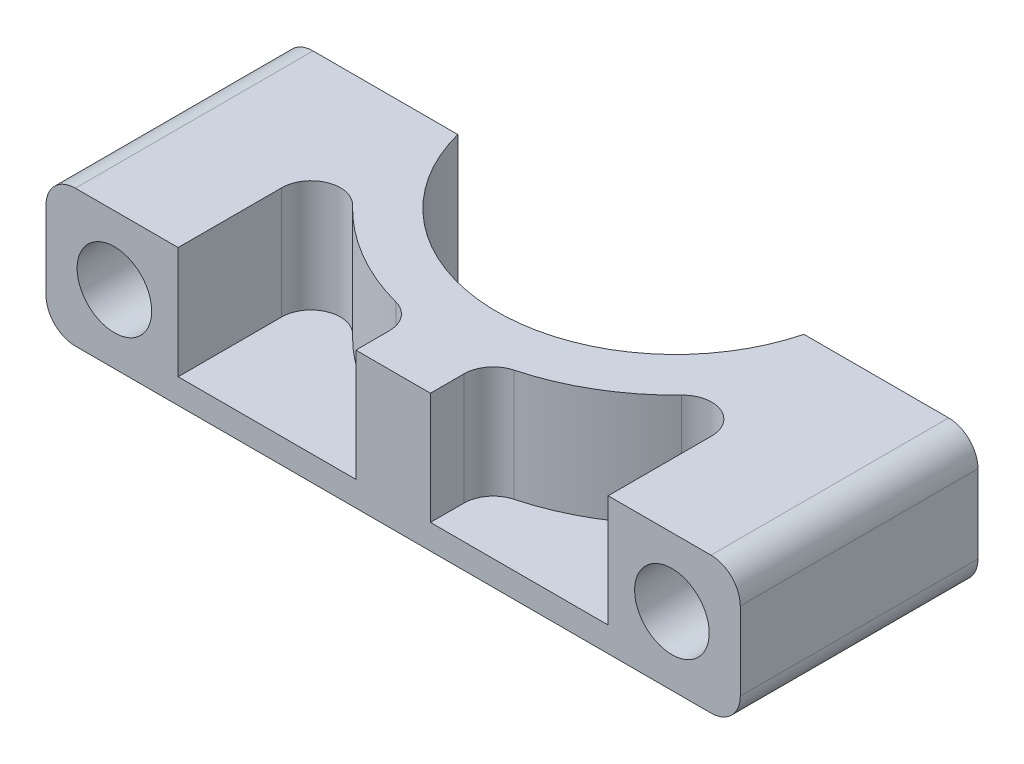
ISO-10303-21;
HEADER;
FILE_DESCRIPTION(('STEP AP214'),'2;1');
FILE_NAME('part.step','',(''),(''),'','','');
FILE_SCHEMA(('AUTOMOTIVE_DESIGN { 1 0 10303 214 1 1 1 1 }'));
ENDSEC;
DATA;
#1=APPLICATION_CONTEXT('core data for automotive mechanical design processes');
#2=APPLICATION_PROTOCOL_DEFINITION('international standard','automotive_design',2000,#1);
#3=PRODUCT_CONTEXT('',#1,'mechanical');
#4=PRODUCT('Part','Part','',(#3));
#5=PRODUCT_RELATED_PRODUCT_CATEGORY('part','',(#4));
#6=PRODUCT_DEFINITION_FORMATION('','',#4);
#7=PRODUCT_DEFINITION_CONTEXT('part definition',#1,'design');
#8=PRODUCT_DEFINITION('design','',#6,#7);
#9=PRODUCT_DEFINITION_SHAPE('','',#8);
#10=(LENGTH_UNIT() NAMED_UNIT(*) SI_UNIT(.MILLI.,.METRE.));
#11=(NAMED_UNIT(*) PLANE_ANGLE_UNIT() SI_UNIT($,.RADIAN.));
#12=(NAMED_UNIT(*) SI_UNIT($,.STERADIAN.) SOLID_ANGLE_UNIT());
#13=UNCERTAINTY_MEASURE_WITH_UNIT(LENGTH_MEASURE(1.E-05),#10,'distance_accuracy_value','');
#14=(GEOMETRIC_REPRESENTATION_CONTEXT(3) GLOBAL_UNCERTAINTY_ASSIGNED_CONTEXT((#13)) GLOBAL_UNIT_ASSIGNED_CONTEXT((#10,
#11,#12)) REPRESENTATION_CONTEXT('',''));
#15=CARTESIAN_POINT('',(0.,0.,0.));
#16=DIRECTION('',(0.,0.,1.));
#17=DIRECTION('',(1.,0.,0.));
#18=AXIS2_PLACEMENT_3D('',#15,#16,#17);
#19=CARTESIAN_POINT('',(-27.9162315761525,11.,22.7193999397355));
#20=DIRECTION('',(0.,0.,-1.));
#21=DIRECTION('',(-1.,0.,0.));
#22=AXIS2_PLACEMENT_3D('',#19,#20,#21);
#23=PLANE('',#22);
#24=DIRECTION('',(1.,0.,0.));
#25=VECTOR('',#24,1.);
#26=CARTESIAN_POINT('',(-27.9162315761525,11.,22.7193999397355));
#27=LINE('',#26,#25);
#28=CARTESIAN_POINT('',(-25.5562315761525,11.,22.7193999397355));
#29=VERTEX_POINT('',#28);
#30=CARTESIAN_POINT('',(-17.2885742756036,11.,22.7193999397355));
#31=VERTEX_POINT('',#30);
#32=EDGE_CURVE('E263',#29,#31,#27,.T.);
#33=ORIENTED_EDGE('',*,*,#32,.F.);
#34=CARTESIAN_POINT('',(-25.5562315761525,8.64,22.7193999397355));
#35=DIRECTION('',(0.,0.,-1.));
#36=DIRECTION('',(-1.,0.,0.));
#37=AXIS2_PLACEMENT_3D('',#34,#35,#36);
#38=CIRCLE('',#37,2.36);
#39=CARTESIAN_POINT('',(-27.9162315761525,8.64,22.7193999397355));
#40=VERTEX_POINT('',#39);
#41=EDGE_CURVE('E346',#29,#40,#38,.F.);
#42=ORIENTED_EDGE('',*,*,#41,.T.);
#43=DIRECTION('',(0.,-1.,0.));
#44=VECTOR('',#43,1.);
#45=CARTESIAN_POINT('',(-27.9162315761525,11.,22.7193999397355));
#46=LINE('',#45,#44);
#47=CARTESIAN_POINT('',(-27.9162315761525,2.36,22.7193999397355));
#48=VERTEX_POINT('',#47);
#49=EDGE_CURVE('E297',#40,#48,#46,.T.);
#50=ORIENTED_EDGE('',*,*,#49,.T.);
#51=CARTESIAN_POINT('',(-25.5562315761525,2.36,22.7193999397355));
#52=DIRECTION('',(0.,0.,-1.));
#53=DIRECTION('',(-1.,0.,0.));
#54=AXIS2_PLACEMENT_3D('',#51,#52,#53);
#55=CIRCLE('',#54,2.36);
#56=CARTESIAN_POINT('',(-25.5562315761525,0.,22.7193999397355));
#57=VERTEX_POINT('',#56);
#58=EDGE_CURVE('E344',#48,#57,#55,.F.);
#59=ORIENTED_EDGE('',*,*,#58,.T.);
#60=DIRECTION('',(1.,0.,0.));
#61=VECTOR('',#60,1.);
#62=CARTESIAN_POINT('',(-27.9162315761525,0.,22.7193999397355));
#63=LINE('',#62,#61);
#64=CARTESIAN_POINT('',(25.5562315761525,0.,22.7193999397355));
#65=VERTEX_POINT('',#64);
#66=EDGE_CURVE('E262',#57,#65,#63,.T.);
#67=ORIENTED_EDGE('',*,*,#66,.T.);
#68=CARTESIAN_POINT('',(25.5562315761525,2.36,22.7193999397355));
#69=DIRECTION('',(0.,0.,-1.));
#70=DIRECTION('',(-1.,0.,0.));
#71=AXIS2_PLACEMENT_3D('',#68,#69,#70);
#72=CIRCLE('',#71,2.36);
#73=CARTESIAN_POINT('',(27.9162315761525,2.36,22.7193999397355));
#74=VERTEX_POINT('',#73);
#75=EDGE_CURVE('E340',#65,#74,#72,.F.);
#76=ORIENTED_EDGE('',*,*,#75,.T.);
#77=DIRECTION('',(0.,-1.,0.));
#78=VECTOR('',#77,1.);
#79=CARTESIAN_POINT('',(27.9162315761525,11.,22.7193999397355));
#80=LINE('',#79,#78);
#81=CARTESIAN_POINT('',(27.9162315761525,8.64,22.7193999397355));
#82=VERTEX_POINT('',#81);
#83=EDGE_CURVE('E294',#82,#74,#80,.T.);
#84=ORIENTED_EDGE('',*,*,#83,.F.);
#85=CARTESIAN_POINT('',(25.5562315761525,8.64,22.7193999397355));
#86=DIRECTION('',(0.,0.,-1.));
#87=DIRECTION('',(-1.,0.,0.));
#88=AXIS2_PLACEMENT_3D('',#85,#86,#87);
#89=CIRCLE('',#88,2.36);
#90=CARTESIAN_POINT('',(25.5562315761525,11.,22.7193999397355));
#91=VERTEX_POINT('',#90);
#92=EDGE_CURVE('E342',#82,#91,#89,.F.);
#93=ORIENTED_EDGE('',*,*,#92,.T.);
#94=CARTESIAN_POINT('',(17.2885742756036,11.,22.7193999397355));
#95=VERTEX_POINT('',#94);
#96=EDGE_CURVE('E267',#95,#91,#27,.T.);
#97=ORIENTED_EDGE('',*,*,#96,.F.);
#98=DIRECTION('',(0.,1.,0.));
#99=VECTOR('',#98,1.);
#100=CARTESIAN_POINT('',(17.2885742756036,2.,22.7193999397355));
#101=LINE('',#100,#99);
#102=CARTESIAN_POINT('',(17.2885742756036,2.,22.7193999397355));
#103=VERTEX_POINT('',#102);
#104=EDGE_CURVE('E220',#103,#95,#101,.T.);
#105=ORIENTED_EDGE('',*,*,#104,.F.);
#106=DIRECTION('',(1.,0.,0.));
#107=VECTOR('',#106,1.);
#108=CARTESIAN_POINT('',(0.,2.,22.7193999397355));
#109=LINE('',#108,#107);
#110=CARTESIAN_POINT('',(3.,2.,22.7193999397355));
#111=VERTEX_POINT('',#110);
#112=EDGE_CURVE('E234',#111,#103,#109,.T.);
#113=ORIENTED_EDGE('',*,*,#112,.F.);
#114=DIRECTION('',(0.,1.,0.));
#115=VECTOR('',#114,1.);
#116=CARTESIAN_POINT('',(3.,2.,22.7193999397355));
#117=LINE('',#116,#115);
#118=CARTESIAN_POINT('',(3.,11.,22.7193999397355));
#119=VERTEX_POINT('',#118);
#120=EDGE_CURVE('E239',#111,#119,#117,.T.);
#121=ORIENTED_EDGE('',*,*,#120,.T.);
#122=CARTESIAN_POINT('',(-3.,11.,22.7193999397355));
#123=VERTEX_POINT('',#122);
#124=EDGE_CURVE('E266',#123,#119,#27,.T.);
#125=ORIENTED_EDGE('',*,*,#124,.F.);
#126=DIRECTION('',(0.,1.,0.));
#127=VECTOR('',#126,1.);
#128=CARTESIAN_POINT('',(-3.,2.,22.7193999397355));
#129=LINE('',#128,#127);
#130=CARTESIAN_POINT('',(-3.,2.,22.7193999397355));
#131=VERTEX_POINT('',#130);
#132=EDGE_CURVE('E207',#131,#123,#129,.T.);
#133=ORIENTED_EDGE('',*,*,#132,.F.);
#134=DIRECTION('',(1.,0.,0.));
#135=VECTOR('',#134,1.);
#136=CARTESIAN_POINT('',(0.,2.,22.7193999397355));
#137=LINE('',#136,#135);
#138=CARTESIAN_POINT('',(-17.2885742756036,2.,22.7193999397355));
#139=VERTEX_POINT('',#138);
#140=EDGE_CURVE('E190',#139,#131,#137,.T.);
#141=ORIENTED_EDGE('',*,*,#140,.F.);
#142=DIRECTION('',(0.,1.,0.));
#143=VECTOR('',#142,1.);
#144=CARTESIAN_POINT('',(-17.2885742756036,2.,22.7193999397355));
#145=LINE('',#144,#143);
#146=EDGE_CURVE('E201',#139,#31,#145,.T.);
#147=ORIENTED_EDGE('',*,*,#146,.T.);
#148=EDGE_LOOP('',(#33,#42,#50,#59,#67,#76,#84,#93,#97,#105,#113,#121,#125,#133,#141,#147));
#149=FACE_BOUND('',#148,.T.);
#150=CARTESIAN_POINT('',(22.4162315761525,5.5,22.7193999397355));
#151=DIRECTION('',(0.,0.,-1.));
#152=DIRECTION('',(-1.,0.,0.));
#153=AXIS2_PLACEMENT_3D('',#150,#151,#152);
#154=CIRCLE('',#153,3.);
#155=CARTESIAN_POINT('',(19.4162315761525,5.5,22.7193999397355));
#156=VERTEX_POINT('',#155);
#157=EDGE_CURVE('E259',#156,#156,#154,.T.);
#158=ORIENTED_EDGE('',*,*,#157,.T.);
#159=EDGE_LOOP('',(#158));
#160=FACE_BOUND('',#159,.T.);
#161=CARTESIAN_POINT('',(-22.4162315761525,5.5,22.7193999397355));
#162=DIRECTION('',(0.,0.,-1.));
#163=DIRECTION('',(-1.,0.,0.));
#164=AXIS2_PLACEMENT_3D('',#161,#162,#163);
#165=CIRCLE('',#164,3.);
#166=CARTESIAN_POINT('',(-25.4162315761525,5.5,22.7193999397355));
#167=VERTEX_POINT('',#166);
#168=EDGE_CURVE('E254',#167,#167,#165,.T.);
#169=ORIENTED_EDGE('',*,*,#168,.T.);
#170=EDGE_LOOP('',(#169));
#171=FACE_BOUND('',#170,.T.);
#172=ADVANCED_FACE('F35',(#149,#160,#171),#23,.F.);
#173=CARTESIAN_POINT('',(0.,11.,0.));
#174=DIRECTION('',(0.,1.,0.));
#175=DIRECTION('',(0.,0.,1.));
#176=AXIS2_PLACEMENT_3D('',#173,#174,#175);
#177=PLANE('',#176);
#178=DIRECTION('',(-1.,0.,0.));
#179=VECTOR('',#178,1.);
#180=CARTESIAN_POINT('',(-27.9162315761525,11.,3.60265509296923));
#181=LINE('',#180,#179);
#182=CARTESIAN_POINT('',(-13.9162315761525,11.,3.60265509296922));
#183=VERTEX_POINT('',#182);
#184=CARTESIAN_POINT('',(-25.5562315761525,11.,3.60265509296923));
#185=VERTEX_POINT('',#184);
#186=EDGE_CURVE('E271',#183,#185,#181,.T.);
#187=ORIENTED_EDGE('',*,*,#186,.T.);
#188=DIRECTION('',(0.,0.,1.));
#189=VECTOR('',#188,1.);
#190=CARTESIAN_POINT('',(-25.5562315761525,11.,22.7193999397355));
#191=LINE('',#190,#189);
#192=EDGE_CURVE('E337',#185,#29,#191,.T.);
#193=ORIENTED_EDGE('',*,*,#192,.T.);
#194=ORIENTED_EDGE('',*,*,#32,.T.);
#195=DIRECTION('',(0.,0.,1.));
#196=VECTOR('',#195,1.);
#197=CARTESIAN_POINT('',(-17.2885742756036,11.,0.));
#198=LINE('',#197,#196);
#199=CARTESIAN_POINT('',(-17.2885742756036,11.,14.3902013570967));
#200=VERTEX_POINT('',#199);
#201=EDGE_CURVE('E204',#200,#31,#198,.T.);
#202=ORIENTED_EDGE('',*,*,#201,.F.);
#203=CARTESIAN_POINT('',(-14.9285742756036,11.,14.3902013570967));
#204=DIRECTION('',(0.,1.,0.));
#205=DIRECTION('',(0.,0.,1.));
#206=AXIS2_PLACEMENT_3D('',#203,#204,#205);
#207=CIRCLE('',#206,2.36);
#208=CARTESIAN_POINT('',(-13.2294454938132,11.,12.7523486827418));
#209=VERTEX_POINT('',#208);
#210=EDGE_CURVE('E326',#200,#209,#207,.F.);
#211=ORIENTED_EDGE('',*,*,#210,.T.);
#212=CARTESIAN_POINT('',(0.,11.,0.));
#213=DIRECTION('',(0.,1.,0.));
#214=DIRECTION('',(0.,0.,1.));
#215=AXIS2_PLACEMENT_3D('',#212,#213,#214);
#216=CIRCLE('',#215,18.375);
#217=CARTESIAN_POINT('',(-4.74993971545696,11.,17.7504562673618));
#218=VERTEX_POINT('',#217);
#219=EDGE_CURVE('E217',#209,#218,#216,.T.);
#220=ORIENTED_EDGE('',*,*,#219,.T.);
#221=CARTESIAN_POINT('',(-5.36,11.,20.0302427593876));
#222=DIRECTION('',(0.,1.,0.));
#223=DIRECTION('',(0.,0.,1.));
#224=AXIS2_PLACEMENT_3D('',#221,#222,#223);
#225=CIRCLE('',#224,2.36);
#226=CARTESIAN_POINT('',(-3.,11.,20.0302427593876));
#227=VERTEX_POINT('',#226);
#228=EDGE_CURVE('E330',#218,#227,#225,.F.);
#229=ORIENTED_EDGE('',*,*,#228,.T.);
#230=DIRECTION('',(0.,0.,-1.));
#231=VECTOR('',#230,1.);
#232=CARTESIAN_POINT('',(-3.,11.,0.));
#233=LINE('',#232,#231);
#234=EDGE_CURVE('E222',#123,#227,#233,.T.);
#235=ORIENTED_EDGE('',*,*,#234,.F.);
#236=ORIENTED_EDGE('',*,*,#124,.T.);
#237=DIRECTION('',(0.,0.,-1.));
#238=VECTOR('',#237,1.);
#239=CARTESIAN_POINT('',(3.,11.,0.));
#240=LINE('',#239,#238);
#241=CARTESIAN_POINT('',(3.,11.,20.0302427593876));
#242=VERTEX_POINT('',#241);
#243=EDGE_CURVE('E243',#119,#242,#240,.T.);
#244=ORIENTED_EDGE('',*,*,#243,.T.);
#245=CARTESIAN_POINT('',(5.36,11.,20.0302427593876));
#246=DIRECTION('',(0.,1.,0.));
#247=DIRECTION('',(0.,0.,1.));
#248=AXIS2_PLACEMENT_3D('',#245,#246,#247);
#249=CIRCLE('',#248,2.36);
#250=CARTESIAN_POINT('',(4.74993971545696,11.,17.7504562673618));
#251=VERTEX_POINT('',#250);
#252=EDGE_CURVE('E332',#242,#251,#249,.F.);
#253=ORIENTED_EDGE('',*,*,#252,.T.);
#254=CARTESIAN_POINT('',(0.,11.,0.));
#255=DIRECTION('',(0.,1.,0.));
#256=DIRECTION('',(0.,0.,1.));
#257=AXIS2_PLACEMENT_3D('',#254,#255,#256);
#258=CIRCLE('',#257,18.375);
#259=CARTESIAN_POINT('',(13.2294454938132,11.,12.7523486827418));
#260=VERTEX_POINT('',#259);
#261=EDGE_CURVE('E240',#251,#260,#258,.T.);
#262=ORIENTED_EDGE('',*,*,#261,.T.);
#263=CARTESIAN_POINT('',(14.9285742756036,11.,14.3902013570967));
#264=DIRECTION('',(0.,1.,0.));
#265=DIRECTION('',(0.,0.,1.));
#266=AXIS2_PLACEMENT_3D('',#263,#264,#265);
#267=CIRCLE('',#266,2.36);
#268=CARTESIAN_POINT('',(17.2885742756036,11.,14.3902013570967));
#269=VERTEX_POINT('',#268);
#270=EDGE_CURVE('E328',#260,#269,#267,.F.);
#271=ORIENTED_EDGE('',*,*,#270,.T.);
#272=DIRECTION('',(0.,0.,1.));
#273=VECTOR('',#272,1.);
#274=CARTESIAN_POINT('',(17.2885742756036,11.,0.));
#275=LINE('',#274,#273);
#276=EDGE_CURVE('E231',#269,#95,#275,.T.);
#277=ORIENTED_EDGE('',*,*,#276,.T.);
#278=ORIENTED_EDGE('',*,*,#96,.T.);
#279=DIRECTION('',(0.,0.,-1.));
#280=VECTOR('',#279,1.);
#281=CARTESIAN_POINT('',(25.5562315761525,11.,3.60265509296923));
#282=LINE('',#281,#280);
#283=CARTESIAN_POINT('',(25.5562315761525,11.,3.60265509296923));
#284=VERTEX_POINT('',#283);
#285=EDGE_CURVE('E334',#91,#284,#282,.T.);
#286=ORIENTED_EDGE('',*,*,#285,.T.);
#287=DIRECTION('',(-1.,0.,0.));
#288=VECTOR('',#287,1.);
#289=CARTESIAN_POINT('',(13.9162315761525,11.,3.60265509296923));
#290=LINE('',#289,#288);
#291=CARTESIAN_POINT('',(13.9162315761525,11.,3.60265509296923));
#292=VERTEX_POINT('',#291);
#293=EDGE_CURVE('E265',#284,#292,#290,.T.);
#294=ORIENTED_EDGE('',*,*,#293,.T.);
#295=CARTESIAN_POINT('',(0.,11.,0.));
#296=DIRECTION('',(0.,-1.,0.));
#297=DIRECTION('',(0.,0.,1.));
#298=AXIS2_PLACEMENT_3D('',#295,#296,#297);
#299=CIRCLE('',#298,14.375);
#300=EDGE_CURVE('E269',#292,#183,#299,.T.);
#301=ORIENTED_EDGE('',*,*,#300,.T.);
#302=EDGE_LOOP('',(#187,#193,#194,#202,#211,#220,#229,#235,#236,#244,#253,#262,#271,#277,#278,
#286,#294,#301));
#303=FACE_BOUND('',#302,.T.);
#304=ADVANCED_FACE('F394',(#303),#177,.T.);
#305=CARTESIAN_POINT('',(-27.9162315761525,11.,22.7193999397355));
#306=DIRECTION('',(1.,0.,0.));
#307=DIRECTION('',(0.,0.,-1.));
#308=AXIS2_PLACEMENT_3D('',#305,#306,#307);
#309=PLANE('',#308);
#310=ORIENTED_EDGE('',*,*,#49,.F.);
#311=DIRECTION('',(0.,0.,1.));
#312=VECTOR('',#311,1.);
#313=CARTESIAN_POINT('',(-27.9162315761525,8.64,3.60265509296923));
#314=LINE('',#313,#312);
#315=CARTESIAN_POINT('',(-27.9162315761525,8.64,3.60265509296923));
#316=VERTEX_POINT('',#315);
#317=EDGE_CURVE('E351',#40,#316,#314,.F.);
#318=ORIENTED_EDGE('',*,*,#317,.T.);
#319=DIRECTION('',(0.,-1.,0.));
#320=VECTOR('',#319,1.);
#321=CARTESIAN_POINT('',(-27.9162315761525,11.,3.60265509296923));
#322=LINE('',#321,#320);
#323=CARTESIAN_POINT('',(-27.9162315761525,2.36,3.60265509296923));
#324=VERTEX_POINT('',#323);
#325=EDGE_CURVE('E274',#316,#324,#322,.T.);
#326=ORIENTED_EDGE('',*,*,#325,.T.);
#327=DIRECTION('',(0.,0.,1.));
#328=VECTOR('',#327,1.);
#329=CARTESIAN_POINT('',(-27.9162315761525,2.36,22.7193999397355));
#330=LINE('',#329,#328);
#331=EDGE_CURVE('E348',#324,#48,#330,.T.);
#332=ORIENTED_EDGE('',*,*,#331,.T.);
#333=EDGE_LOOP('',(#310,#318,#326,#332));
#334=FACE_BOUND('',#333,.T.);
#335=ADVANCED_FACE('F387',(#334),#309,.F.);
#336=CARTESIAN_POINT('',(27.9162315761525,11.,22.7193999397355));
#337=DIRECTION('',(-1.,0.,0.));
#338=DIRECTION('',(0.,0.,1.));
#339=AXIS2_PLACEMENT_3D('',#336,#337,#338);
#340=PLANE('',#339);
#341=DIRECTION('',(0.,-1.,0.));
#342=VECTOR('',#341,1.);
#343=CARTESIAN_POINT('',(27.9162315761525,11.,3.60265509296923));
#344=LINE('',#343,#342);
#345=CARTESIAN_POINT('',(27.9162315761525,8.64,3.60265509296923));
#346=VERTEX_POINT('',#345);
#347=CARTESIAN_POINT('',(27.9162315761525,2.36,3.60265509296923));
#348=VERTEX_POINT('',#347);
#349=EDGE_CURVE('E292',#346,#348,#344,.T.);
#350=ORIENTED_EDGE('',*,*,#349,.F.);
#351=DIRECTION('',(0.,0.,-1.));
#352=VECTOR('',#351,1.);
#353=CARTESIAN_POINT('',(27.9162315761525,8.64,22.7193999397355));
#354=LINE('',#353,#352);
#355=EDGE_CURVE('E11',#346,#82,#354,.F.);
#356=ORIENTED_EDGE('',*,*,#355,.T.);
#357=ORIENTED_EDGE('',*,*,#83,.T.);
#358=DIRECTION('',(0.,0.,-1.));
#359=VECTOR('',#358,1.);
#360=CARTESIAN_POINT('',(27.9162315761525,2.36,22.7193999397355));
#361=LINE('',#360,#359);
#362=EDGE_CURVE('E43',#74,#348,#361,.T.);
#363=ORIENTED_EDGE('',*,*,#362,.T.);
#364=EDGE_LOOP('',(#350,#356,#357,#363));
#365=FACE_BOUND('',#364,.T.);
#366=ADVANCED_FACE('F363',(#365),#340,.F.);
#367=CARTESIAN_POINT('',(13.9162315761525,11.,3.60265509296923));
#368=DIRECTION('',(0.,0.,1.));
#369=DIRECTION('',(1.,0.,0.));
#370=AXIS2_PLACEMENT_3D('',#367,#368,#369);
#371=PLANE('',#370);
#372=CARTESIAN_POINT('',(22.4162315761525,5.5,3.60265509296923));
#373=DIRECTION('',(0.,0.,-1.));
#374=DIRECTION('',(-1.,0.,0.));
#375=AXIS2_PLACEMENT_3D('',#372,#373,#374);
#376=CIRCLE('',#375,3.);
#377=CARTESIAN_POINT('',(19.4162315761525,5.5,3.60265509296923));
#378=VERTEX_POINT('',#377);
#379=EDGE_CURVE('E225',#378,#378,#376,.T.);
#380=ORIENTED_EDGE('',*,*,#379,.F.);
#381=EDGE_LOOP('',(#380));
#382=FACE_BOUND('',#381,.T.);
#383=ORIENTED_EDGE('',*,*,#293,.F.);
#384=CARTESIAN_POINT('',(25.5562315761525,8.64,3.60265509296923));
#385=DIRECTION('',(0.,0.,1.));
#386=DIRECTION('',(1.,0.,0.));
#387=AXIS2_PLACEMENT_3D('',#384,#385,#386);
#388=CIRCLE('',#387,2.36);
#389=EDGE_CURVE('E58',#284,#346,#388,.F.);
#390=ORIENTED_EDGE('',*,*,#389,.T.);
#391=ORIENTED_EDGE('',*,*,#349,.T.);
#392=CARTESIAN_POINT('',(25.5562315761525,2.36,3.60265509296923));
#393=DIRECTION('',(0.,0.,1.));
#394=DIRECTION('',(1.,0.,0.));
#395=AXIS2_PLACEMENT_3D('',#392,#393,#394);
#396=CIRCLE('',#395,2.36);
#397=CARTESIAN_POINT('',(25.5562315761525,0.,3.60265509296923));
#398=VERTEX_POINT('',#397);
#399=EDGE_CURVE('E50',#348,#398,#396,.F.);
#400=ORIENTED_EDGE('',*,*,#399,.T.);
#401=DIRECTION('',(-1.,0.,0.));
#402=VECTOR('',#401,1.);
#403=CARTESIAN_POINT('',(13.9162315761525,0.,3.60265509296923));
#404=LINE('',#403,#402);
#405=CARTESIAN_POINT('',(13.9162315761525,0.,3.60265509296923));
#406=VERTEX_POINT('',#405);
#407=EDGE_CURVE('E277',#398,#406,#404,.T.);
#408=ORIENTED_EDGE('',*,*,#407,.T.);
#409=DIRECTION('',(0.,-1.,0.));
#410=VECTOR('',#409,1.);
#411=CARTESIAN_POINT('',(13.9162315761525,11.,3.60265509296923));
#412=LINE('',#411,#410);
#413=EDGE_CURVE('E289',#292,#406,#412,.T.);
#414=ORIENTED_EDGE('',*,*,#413,.F.);
#415=EDGE_LOOP('',(#383,#390,#391,#400,#408,#414));
#416=FACE_BOUND('',#415,.T.);
#417=ADVANCED_FACE('F367',(#382,#416),#371,.F.);
#418=CARTESIAN_POINT('',(0.,11.,0.));
#419=DIRECTION('',(0.,-1.,0.));
#420=DIRECTION('',(0.,0.,-1.));
#421=AXIS2_PLACEMENT_3D('',#418,#419,#420);
#422=CYLINDRICAL_SURFACE('',#421,14.375);
#423=CARTESIAN_POINT('',(0.,0.,0.));
#424=DIRECTION('',(0.,-1.,0.));
#425=DIRECTION('',(0.,0.,1.));
#426=AXIS2_PLACEMENT_3D('',#423,#424,#425);
#427=CIRCLE('',#426,14.375);
#428=CARTESIAN_POINT('',(-13.9162315761525,0.,3.60265509296922));
#429=VERTEX_POINT('',#428);
#430=EDGE_CURVE('E279',#406,#429,#427,.T.);
#431=ORIENTED_EDGE('',*,*,#430,.T.);
#432=DIRECTION('',(0.,-1.,0.));
#433=VECTOR('',#432,1.);
#434=CARTESIAN_POINT('',(-13.9162315761525,11.,3.60265509296922));
#435=LINE('',#434,#433);
#436=EDGE_CURVE('E286',#183,#429,#435,.T.);
#437=ORIENTED_EDGE('',*,*,#436,.F.);
#438=ORIENTED_EDGE('',*,*,#300,.F.);
#439=ORIENTED_EDGE('',*,*,#413,.T.);
#440=EDGE_LOOP('',(#431,#437,#438,#439));
#441=FACE_BOUND('',#440,.T.);
#442=ADVANCED_FACE('F398',(#441),#422,.F.);
#443=CARTESIAN_POINT('',(-27.9162315761525,11.,3.60265509296923));
#444=DIRECTION('',(0.,0.,1.));
#445=DIRECTION('',(1.,0.,0.));
#446=AXIS2_PLACEMENT_3D('',#443,#444,#445);
#447=PLANE('',#446);
#448=CARTESIAN_POINT('',(-22.4162315761525,5.5,3.60265509296923));
#449=DIRECTION('',(0.,0.,-1.));
#450=DIRECTION('',(-1.,0.,0.));
#451=AXIS2_PLACEMENT_3D('',#448,#449,#450);
#452=CIRCLE('',#451,3.);
#453=CARTESIAN_POINT('',(-25.4162315761525,5.5,3.60265509296923));
#454=VERTEX_POINT('',#453);
#455=EDGE_CURVE('E251',#454,#454,#452,.T.);
#456=ORIENTED_EDGE('',*,*,#455,.F.);
#457=EDGE_LOOP('',(#456));
#458=FACE_BOUND('',#457,.T.);
#459=ORIENTED_EDGE('',*,*,#325,.F.);
#460=CARTESIAN_POINT('',(-25.5562315761525,8.64,3.60265509296923));
#461=DIRECTION('',(0.,0.,1.));
#462=DIRECTION('',(1.,0.,0.));
#463=AXIS2_PLACEMENT_3D('',#460,#461,#462);
#464=CIRCLE('',#463,2.36);
#465=EDGE_CURVE('E355',#316,#185,#464,.F.);
#466=ORIENTED_EDGE('',*,*,#465,.T.);
#467=ORIENTED_EDGE('',*,*,#186,.F.);
#468=ORIENTED_EDGE('',*,*,#436,.T.);
#469=DIRECTION('',(-1.,0.,0.));
#470=VECTOR('',#469,1.);
#471=CARTESIAN_POINT('',(-27.9162315761525,0.,3.60265509296923));
#472=LINE('',#471,#470);
#473=CARTESIAN_POINT('',(-25.5562315761525,0.,3.60265509296923));
#474=VERTEX_POINT('',#473);
#475=EDGE_CURVE('E281',#429,#474,#472,.T.);
#476=ORIENTED_EDGE('',*,*,#475,.T.);
#477=CARTESIAN_POINT('',(-25.5562315761525,2.36,3.60265509296923));
#478=DIRECTION('',(0.,0.,1.));
#479=DIRECTION('',(1.,0.,0.));
#480=AXIS2_PLACEMENT_3D('',#477,#478,#479);
#481=CIRCLE('',#480,2.36);
#482=EDGE_CURVE('E353',#474,#324,#481,.F.);
#483=ORIENTED_EDGE('',*,*,#482,.T.);
#484=EDGE_LOOP('',(#459,#466,#467,#468,#476,#483));
#485=FACE_BOUND('',#484,.T.);
#486=ADVANCED_FACE('F383',(#458,#485),#447,.F.);
#487=CARTESIAN_POINT('',(0.,0.,0.));
#488=DIRECTION('',(0.,1.,0.));
#489=DIRECTION('',(0.,0.,1.));
#490=AXIS2_PLACEMENT_3D('',#487,#488,#489);
#491=PLANE('',#490);
#492=ORIENTED_EDGE('',*,*,#66,.F.);
#493=DIRECTION('',(0.,0.,1.));
#494=VECTOR('',#493,1.);
#495=CARTESIAN_POINT('',(-25.5562315761525,0.,0.));
#496=LINE('',#495,#494);
#497=EDGE_CURVE('E359',#57,#474,#496,.F.);
#498=ORIENTED_EDGE('',*,*,#497,.T.);
#499=ORIENTED_EDGE('',*,*,#475,.F.);
#500=ORIENTED_EDGE('',*,*,#430,.F.);
#501=ORIENTED_EDGE('',*,*,#407,.F.);
#502=DIRECTION('',(0.,0.,-1.));
#503=VECTOR('',#502,1.);
#504=CARTESIAN_POINT('',(25.5562315761525,0.,0.));
#505=LINE('',#504,#503);
#506=EDGE_CURVE('E357',#398,#65,#505,.F.);
#507=ORIENTED_EDGE('',*,*,#506,.T.);
#508=EDGE_LOOP('',(#492,#498,#499,#500,#501,#507));
#509=FACE_BOUND('',#508,.T.);
#510=ADVANCED_FACE('F373',(#509),#491,.F.);
#511=CARTESIAN_POINT('',(-22.4162315761525,5.5,33.6026550929692));
#512=DIRECTION('',(0.,0.,-1.));
#513=DIRECTION('',(-1.,0.,0.));
#514=AXIS2_PLACEMENT_3D('',#511,#512,#513);
#515=CYLINDRICAL_SURFACE('',#514,3.);
#516=ORIENTED_EDGE('',*,*,#455,.T.);
#517=EDGE_LOOP('',(#516));
#518=FACE_BOUND('',#517,.T.);
#519=ORIENTED_EDGE('',*,*,#168,.F.);
#520=EDGE_LOOP('',(#519));
#521=FACE_BOUND('',#520,.T.);
#522=ADVANCED_FACE('F482',(#518,#521),#515,.F.);
#523=CARTESIAN_POINT('',(22.4162315761525,5.5,33.6026550929692));
#524=DIRECTION('',(0.,0.,-1.));
#525=DIRECTION('',(-1.,0.,0.));
#526=AXIS2_PLACEMENT_3D('',#523,#524,#525);
#527=CYLINDRICAL_SURFACE('',#526,3.);
#528=ORIENTED_EDGE('',*,*,#379,.T.);
#529=EDGE_LOOP('',(#528));
#530=FACE_BOUND('',#529,.T.);
#531=ORIENTED_EDGE('',*,*,#157,.F.);
#532=EDGE_LOOP('',(#531));
#533=FACE_BOUND('',#532,.T.);
#534=ADVANCED_FACE('F477',(#530,#533),#527,.F.);
#535=CARTESIAN_POINT('',(0.,2.,0.));
#536=DIRECTION('',(0.,1.,0.));
#537=DIRECTION('',(0.,0.,1.));
#538=AXIS2_PLACEMENT_3D('',#535,#536,#537);
#539=CYLINDRICAL_SURFACE('',#538,18.375);
#540=CARTESIAN_POINT('',(0.,2.,0.));
#541=DIRECTION('',(0.,1.,0.));
#542=DIRECTION('',(0.,0.,1.));
#543=AXIS2_PLACEMENT_3D('',#540,#541,#542);
#544=CIRCLE('',#543,18.375);
#545=CARTESIAN_POINT('',(4.74993971545696,2.,17.7504562673618));
#546=VERTEX_POINT('',#545);
#547=CARTESIAN_POINT('',(13.2294454938132,2.,12.7523486827418));
#548=VERTEX_POINT('',#547);
#549=EDGE_CURVE('E227',#546,#548,#544,.T.);
#550=ORIENTED_EDGE('',*,*,#549,.T.);
#551=DIRECTION('',(0.,1.,0.));
#552=VECTOR('',#551,1.);
#553=CARTESIAN_POINT('',(13.2294454938132,2.,12.7523486827418));
#554=LINE('',#553,#552);
#555=EDGE_CURVE('E312',#548,#260,#554,.T.);
#556=ORIENTED_EDGE('',*,*,#555,.T.);
#557=ORIENTED_EDGE('',*,*,#261,.F.);
#558=DIRECTION('',(0.,1.,0.));
#559=VECTOR('',#558,1.);
#560=CARTESIAN_POINT('',(4.74993971545696,2.,17.7504562673618));
#561=LINE('',#560,#559);
#562=EDGE_CURVE('E310',#251,#546,#561,.F.);
#563=ORIENTED_EDGE('',*,*,#562,.T.);
#564=EDGE_LOOP('',(#550,#556,#557,#563));
#565=FACE_BOUND('',#564,.T.);
#566=ADVANCED_FACE('F464',(#565),#539,.T.);
#567=CARTESIAN_POINT('',(17.2885742756036,2.,0.));
#568=DIRECTION('',(-1.,0.,0.));
#569=DIRECTION('',(0.,0.,1.));
#570=AXIS2_PLACEMENT_3D('',#567,#568,#569);
#571=PLANE('',#570);
#572=ORIENTED_EDGE('',*,*,#276,.F.);
#573=DIRECTION('',(0.,-1.,0.));
#574=VECTOR('',#573,1.);
#575=CARTESIAN_POINT('',(17.2885742756036,2.,14.3902013570967));
#576=LINE('',#575,#574);
#577=CARTESIAN_POINT('',(17.2885742756036,2.,14.3902013570967));
#578=VERTEX_POINT('',#577);
#579=EDGE_CURVE('E315',#269,#578,#576,.T.);
#580=ORIENTED_EDGE('',*,*,#579,.T.);
#581=DIRECTION('',(0.,0.,1.));
#582=VECTOR('',#581,1.);
#583=CARTESIAN_POINT('',(17.2885742756036,2.,0.));
#584=LINE('',#583,#582);
#585=EDGE_CURVE('E237',#578,#103,#584,.T.);
#586=ORIENTED_EDGE('',*,*,#585,.T.);
#587=ORIENTED_EDGE('',*,*,#104,.T.);
#588=EDGE_LOOP('',(#572,#580,#586,#587));
#589=FACE_BOUND('',#588,.T.);
#590=ADVANCED_FACE('F469',(#589),#571,.T.);
#591=CARTESIAN_POINT('',(3.,2.,0.));
#592=DIRECTION('',(1.,0.,0.));
#593=DIRECTION('',(0.,0.,-1.));
#594=AXIS2_PLACEMENT_3D('',#591,#592,#593);
#595=PLANE('',#594);
#596=DIRECTION('',(0.,0.,-1.));
#597=VECTOR('',#596,1.);
#598=CARTESIAN_POINT('',(3.,2.,0.));
#599=LINE('',#598,#597);
#600=CARTESIAN_POINT('',(3.,2.,20.0302427593876));
#601=VERTEX_POINT('',#600);
#602=EDGE_CURVE('E230',#111,#601,#599,.T.);
#603=ORIENTED_EDGE('',*,*,#602,.T.);
#604=DIRECTION('',(0.,-1.,0.));
#605=VECTOR('',#604,1.);
#606=CARTESIAN_POINT('',(3.,11.,20.0302427593876));
#607=LINE('',#606,#605);
#608=EDGE_CURVE('E323',#601,#242,#607,.F.);
#609=ORIENTED_EDGE('',*,*,#608,.T.);
#610=ORIENTED_EDGE('',*,*,#243,.F.);
#611=ORIENTED_EDGE('',*,*,#120,.F.);
#612=EDGE_LOOP('',(#603,#609,#610,#611));
#613=FACE_BOUND('',#612,.T.);
#614=ADVANCED_FACE('F454',(#613),#595,.T.);
#615=CARTESIAN_POINT('',(0.,2.,0.));
#616=DIRECTION('',(0.,1.,0.));
#617=DIRECTION('',(0.,0.,1.));
#618=AXIS2_PLACEMENT_3D('',#615,#616,#617);
#619=PLANE('',#618);
#620=ORIENTED_EDGE('',*,*,#585,.F.);
#621=CARTESIAN_POINT('',(14.9285742756036,2.,14.3902013570967));
#622=DIRECTION('',(0.,1.,0.));
#623=DIRECTION('',(0.,0.,1.));
#624=AXIS2_PLACEMENT_3D('',#621,#622,#623);
#625=CIRCLE('',#624,2.36);
#626=EDGE_CURVE('E319',#578,#548,#625,.T.);
#627=ORIENTED_EDGE('',*,*,#626,.T.);
#628=ORIENTED_EDGE('',*,*,#549,.F.);
#629=CARTESIAN_POINT('',(5.36,2.,20.0302427593876));
#630=DIRECTION('',(0.,1.,0.));
#631=DIRECTION('',(0.,0.,1.));
#632=AXIS2_PLACEMENT_3D('',#629,#630,#631);
#633=CIRCLE('',#632,2.36);
#634=EDGE_CURVE('E317',#546,#601,#633,.T.);
#635=ORIENTED_EDGE('',*,*,#634,.T.);
#636=ORIENTED_EDGE('',*,*,#602,.F.);
#637=ORIENTED_EDGE('',*,*,#112,.T.);
#638=EDGE_LOOP('',(#620,#627,#628,#635,#636,#637));
#639=FACE_BOUND('',#638,.T.);
#640=ADVANCED_FACE('F458',(#639),#619,.T.);
#641=CARTESIAN_POINT('',(0.,2.,0.));
#642=DIRECTION('',(0.,1.,0.));
#643=DIRECTION('',(0.,0.,1.));
#644=AXIS2_PLACEMENT_3D('',#641,#642,#643);
#645=CYLINDRICAL_SURFACE('',#644,18.375);
#646=ORIENTED_EDGE('',*,*,#219,.F.);
#647=DIRECTION('',(0.,1.,0.));
#648=VECTOR('',#647,1.);
#649=CARTESIAN_POINT('',(-13.2294454938132,2.,12.7523486827418));
#650=LINE('',#649,#648);
#651=CARTESIAN_POINT('',(-13.2294454938132,2.,12.7523486827418));
#652=VERTEX_POINT('',#651);
#653=EDGE_CURVE('E305',#209,#652,#650,.F.);
#654=ORIENTED_EDGE('',*,*,#653,.T.);
#655=CARTESIAN_POINT('',(0.,2.,0.));
#656=DIRECTION('',(0.,1.,0.));
#657=DIRECTION('',(0.,0.,1.));
#658=AXIS2_PLACEMENT_3D('',#655,#656,#657);
#659=CIRCLE('',#658,18.375);
#660=CARTESIAN_POINT('',(-4.74993971545696,2.,17.7504562673618));
#661=VERTEX_POINT('',#660);
#662=EDGE_CURVE('E197',#652,#661,#659,.T.);
#663=ORIENTED_EDGE('',*,*,#662,.T.);
#664=DIRECTION('',(0.,1.,0.));
#665=VECTOR('',#664,1.);
#666=CARTESIAN_POINT('',(-4.74993971545696,2.,17.7504562673618));
#667=LINE('',#666,#665);
#668=EDGE_CURVE('E302',#661,#218,#667,.T.);
#669=ORIENTED_EDGE('',*,*,#668,.T.);
#670=EDGE_LOOP('',(#646,#654,#663,#669));
#671=FACE_BOUND('',#670,.T.);
#672=ADVANCED_FACE('F527',(#671),#645,.T.);
#673=CARTESIAN_POINT('',(-3.,2.,0.));
#674=DIRECTION('',(1.,0.,0.));
#675=DIRECTION('',(0.,0.,-1.));
#676=AXIS2_PLACEMENT_3D('',#673,#674,#675);
#677=PLANE('',#676);
#678=ORIENTED_EDGE('',*,*,#234,.T.);
#679=DIRECTION('',(0.,1.,0.));
#680=VECTOR('',#679,1.);
#681=CARTESIAN_POINT('',(-3.,2.,20.0302427593876));
#682=LINE('',#681,#680);
#683=CARTESIAN_POINT('',(-3.,2.,20.0302427593876));
#684=VERTEX_POINT('',#683);
#685=EDGE_CURVE('E321',#227,#684,#682,.F.);
#686=ORIENTED_EDGE('',*,*,#685,.T.);
#687=DIRECTION('',(0.,0.,-1.));
#688=VECTOR('',#687,1.);
#689=CARTESIAN_POINT('',(-3.,2.,0.));
#690=LINE('',#689,#688);
#691=EDGE_CURVE('E208',#131,#684,#690,.T.);
#692=ORIENTED_EDGE('',*,*,#691,.F.);
#693=ORIENTED_EDGE('',*,*,#132,.T.);
#694=EDGE_LOOP('',(#678,#686,#692,#693));
#695=FACE_BOUND('',#694,.T.);
#696=ADVANCED_FACE('F535',(#695),#677,.F.);
#697=CARTESIAN_POINT('',(-17.2885742756036,2.,0.));
#698=DIRECTION('',(-1.,0.,0.));
#699=DIRECTION('',(0.,0.,1.));
#700=AXIS2_PLACEMENT_3D('',#697,#698,#699);
#701=PLANE('',#700);
#702=DIRECTION('',(0.,0.,1.));
#703=VECTOR('',#702,1.);
#704=CARTESIAN_POINT('',(-17.2885742756036,2.,0.));
#705=LINE('',#704,#703);
#706=CARTESIAN_POINT('',(-17.2885742756036,2.,14.3902013570967));
#707=VERTEX_POINT('',#706);
#708=EDGE_CURVE('E184',#707,#139,#705,.T.);
#709=ORIENTED_EDGE('',*,*,#708,.F.);
#710=DIRECTION('',(0.,1.,0.));
#711=VECTOR('',#710,1.);
#712=CARTESIAN_POINT('',(-17.2885742756036,2.,14.3902013570967));
#713=LINE('',#712,#711);
#714=EDGE_CURVE('E300',#707,#200,#713,.T.);
#715=ORIENTED_EDGE('',*,*,#714,.T.);
#716=ORIENTED_EDGE('',*,*,#201,.T.);
#717=ORIENTED_EDGE('',*,*,#146,.F.);
#718=EDGE_LOOP('',(#709,#715,#716,#717));
#719=FACE_BOUND('',#718,.T.);
#720=ADVANCED_FACE('F202',(#719),#701,.F.);
#721=CARTESIAN_POINT('',(0.,2.,0.));
#722=DIRECTION('',(0.,1.,0.));
#723=DIRECTION('',(0.,0.,1.));
#724=AXIS2_PLACEMENT_3D('',#721,#722,#723);
#725=PLANE('',#724);
#726=ORIENTED_EDGE('',*,*,#662,.F.);
#727=CARTESIAN_POINT('',(-14.9285742756036,2.,14.3902013570967));
#728=DIRECTION('',(0.,1.,0.));
#729=DIRECTION('',(0.,0.,1.));
#730=AXIS2_PLACEMENT_3D('',#727,#728,#729);
#731=CIRCLE('',#730,2.36);
#732=EDGE_CURVE('E193',#652,#707,#731,.T.);
#733=ORIENTED_EDGE('',*,*,#732,.T.);
#734=ORIENTED_EDGE('',*,*,#708,.T.);
#735=ORIENTED_EDGE('',*,*,#140,.T.);
#736=ORIENTED_EDGE('',*,*,#691,.T.);
#737=CARTESIAN_POINT('',(-5.36,2.,20.0302427593876));
#738=DIRECTION('',(0.,1.,0.));
#739=DIRECTION('',(0.,0.,1.));
#740=AXIS2_PLACEMENT_3D('',#737,#738,#739);
#741=CIRCLE('',#740,2.36);
#742=EDGE_CURVE('E307',#684,#661,#741,.T.);
#743=ORIENTED_EDGE('',*,*,#742,.T.);
#744=EDGE_LOOP('',(#726,#733,#734,#735,#736,#743));
#745=FACE_BOUND('',#744,.T.);
#746=ADVANCED_FACE('F187',(#745),#725,.T.);
#747=CARTESIAN_POINT('',(-14.9285742756036,2.,14.3902013570967));
#748=DIRECTION('',(0.,1.,0.));
#749=DIRECTION('',(0.,0.,1.));
#750=AXIS2_PLACEMENT_3D('',#747,#748,#749);
#751=CYLINDRICAL_SURFACE('',#750,2.36);
#752=ORIENTED_EDGE('',*,*,#732,.F.);
#753=ORIENTED_EDGE('',*,*,#653,.F.);
#754=ORIENTED_EDGE('',*,*,#210,.F.);
#755=ORIENTED_EDGE('',*,*,#714,.F.);
#756=EDGE_LOOP('',(#752,#753,#754,#755));
#757=FACE_BOUND('',#756,.T.);
#758=ADVANCED_FACE('F419',(#757),#751,.F.);
#759=CARTESIAN_POINT('',(14.9285742756036,2.,14.3902013570967));
#760=DIRECTION('',(0.,1.,0.));
#761=DIRECTION('',(0.,0.,1.));
#762=AXIS2_PLACEMENT_3D('',#759,#760,#761);
#763=CYLINDRICAL_SURFACE('',#762,2.36);
#764=ORIENTED_EDGE('',*,*,#626,.F.);
#765=ORIENTED_EDGE('',*,*,#579,.F.);
#766=ORIENTED_EDGE('',*,*,#270,.F.);
#767=ORIENTED_EDGE('',*,*,#555,.F.);
#768=EDGE_LOOP('',(#764,#765,#766,#767));
#769=FACE_BOUND('',#768,.T.);
#770=ADVANCED_FACE('F422',(#769),#763,.F.);
#771=CARTESIAN_POINT('',(-5.36,2.,20.0302427593876));
#772=DIRECTION('',(0.,1.,0.));
#773=DIRECTION('',(0.,0.,1.));
#774=AXIS2_PLACEMENT_3D('',#771,#772,#773);
#775=CYLINDRICAL_SURFACE('',#774,2.36);
#776=ORIENTED_EDGE('',*,*,#742,.F.);
#777=ORIENTED_EDGE('',*,*,#685,.F.);
#778=ORIENTED_EDGE('',*,*,#228,.F.);
#779=ORIENTED_EDGE('',*,*,#668,.F.);
#780=EDGE_LOOP('',(#776,#777,#778,#779));
#781=FACE_BOUND('',#780,.T.);
#782=ADVANCED_FACE('F426',(#781),#775,.F.);
#783=CARTESIAN_POINT('',(5.36,2.,20.0302427593876));
#784=DIRECTION('',(0.,1.,0.));
#785=DIRECTION('',(0.,0.,1.));
#786=AXIS2_PLACEMENT_3D('',#783,#784,#785);
#787=CYLINDRICAL_SURFACE('',#786,2.36);
#788=ORIENTED_EDGE('',*,*,#634,.F.);
#789=ORIENTED_EDGE('',*,*,#562,.F.);
#790=ORIENTED_EDGE('',*,*,#252,.F.);
#791=ORIENTED_EDGE('',*,*,#608,.F.);
#792=EDGE_LOOP('',(#788,#789,#790,#791));
#793=FACE_BOUND('',#792,.T.);
#794=ADVANCED_FACE('F430',(#793),#787,.F.);
#795=CARTESIAN_POINT('',(-25.5562315761525,8.64,0.));
#796=DIRECTION('',(0.,0.,-1.));
#797=DIRECTION('',(-1.,0.,0.));
#798=AXIS2_PLACEMENT_3D('',#795,#796,#797);
#799=CYLINDRICAL_SURFACE('',#798,2.36);
#800=ORIENTED_EDGE('',*,*,#465,.F.);
#801=ORIENTED_EDGE('',*,*,#317,.F.);
#802=ORIENTED_EDGE('',*,*,#41,.F.);
#803=ORIENTED_EDGE('',*,*,#192,.F.);
#804=EDGE_LOOP('',(#800,#801,#802,#803));
#805=FACE_BOUND('',#804,.T.);
#806=ADVANCED_FACE('F390',(#805),#799,.T.);
#807=CARTESIAN_POINT('',(-25.5562315761525,2.36,22.7193999397355));
#808=DIRECTION('',(0.,0.,1.));
#809=DIRECTION('',(1.,0.,0.));
#810=AXIS2_PLACEMENT_3D('',#807,#808,#809);
#811=CYLINDRICAL_SURFACE('',#810,2.36);
#812=ORIENTED_EDGE('',*,*,#482,.F.);
#813=ORIENTED_EDGE('',*,*,#497,.F.);
#814=ORIENTED_EDGE('',*,*,#58,.F.);
#815=ORIENTED_EDGE('',*,*,#331,.F.);
#816=EDGE_LOOP('',(#812,#813,#814,#815));
#817=FACE_BOUND('',#816,.T.);
#818=ADVANCED_FACE('F379',(#817),#811,.T.);
#819=CARTESIAN_POINT('',(25.5562315761525,8.64,0.));
#820=DIRECTION('',(0.,0.,1.));
#821=DIRECTION('',(1.,0.,0.));
#822=AXIS2_PLACEMENT_3D('',#819,#820,#821);
#823=CYLINDRICAL_SURFACE('',#822,2.36);
#824=ORIENTED_EDGE('',*,*,#92,.F.);
#825=ORIENTED_EDGE('',*,*,#355,.F.);
#826=ORIENTED_EDGE('',*,*,#389,.F.);
#827=ORIENTED_EDGE('',*,*,#285,.F.);
#828=EDGE_LOOP('',(#824,#825,#826,#827));
#829=FACE_BOUND('',#828,.T.);
#830=ADVANCED_FACE('F438',(#829),#823,.T.);
#831=CARTESIAN_POINT('',(25.5562315761525,2.36,22.7193999397355));
#832=DIRECTION('',(0.,0.,-1.));
#833=DIRECTION('',(-1.,0.,0.));
#834=AXIS2_PLACEMENT_3D('',#831,#832,#833);
#835=CYLINDRICAL_SURFACE('',#834,2.36);
#836=ORIENTED_EDGE('',*,*,#75,.F.);
#837=ORIENTED_EDGE('',*,*,#506,.F.);
#838=ORIENTED_EDGE('',*,*,#399,.F.);
#839=ORIENTED_EDGE('',*,*,#362,.F.);
#840=EDGE_LOOP('',(#836,#837,#838,#839));
#841=FACE_BOUND('',#840,.T.);
#842=ADVANCED_FACE('F37',(#841),#835,.T.);
#843=CLOSED_SHELL('',(#172,#304,#335,#366,#417,#442,#486,#510,#522,#534,#566,#590,#614,#640,
#672,#696,#720,#746,#758,#770,#782,#794,#806,#818,#830,#842));
#844=MANIFOLD_SOLID_BREP('B2',#843);
#845=ADVANCED_BREP_SHAPE_REPRESENTATION('',(#18,#844),#14);
#846=SHAPE_DEFINITION_REPRESENTATION(#9,#845);
ENDSEC;
END-ISO-10303-21;
